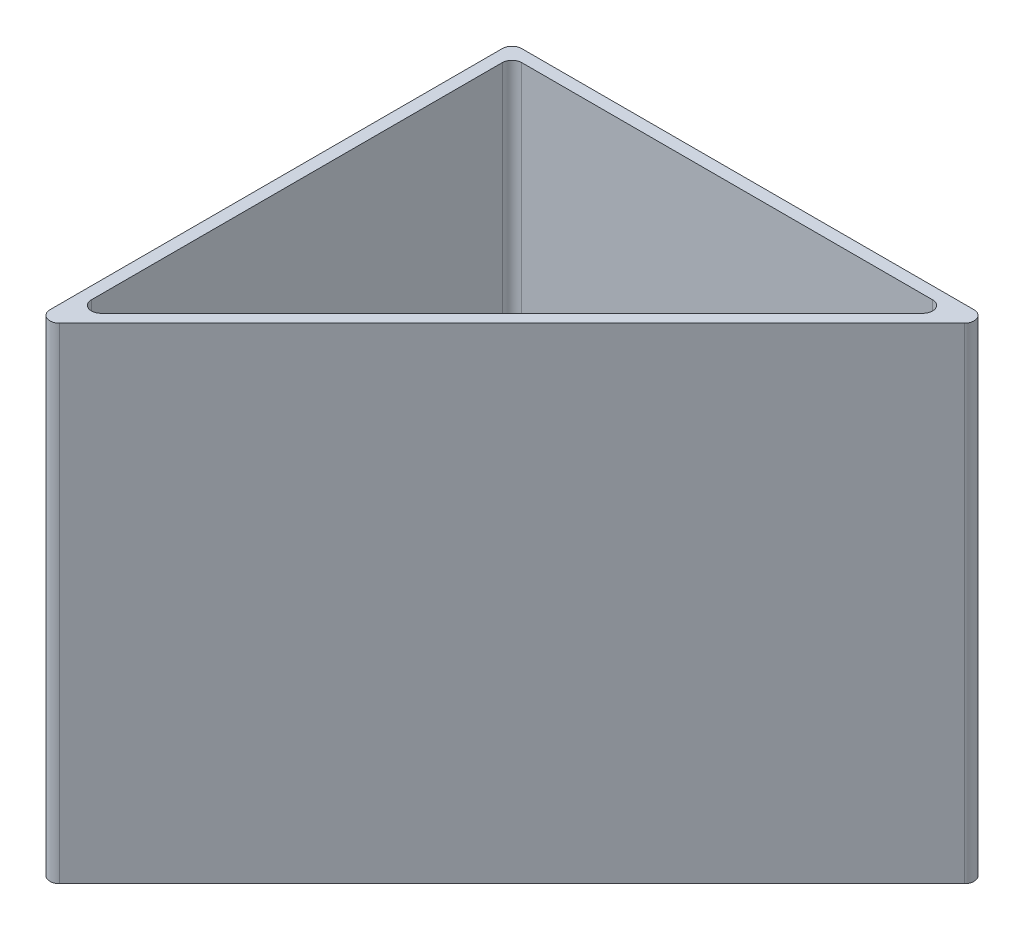
ISO-10303-21;
HEADER;
FILE_DESCRIPTION(('STEP AP214'),'2;1');
FILE_NAME('part.step','',(''),(''),'','','');
FILE_SCHEMA(('AUTOMOTIVE_DESIGN { 1 0 10303 214 1 1 1 1 }'));
ENDSEC;
DATA;
#1=APPLICATION_CONTEXT('core data for automotive mechanical design processes');
#2=APPLICATION_PROTOCOL_DEFINITION('international standard','automotive_design',2000,#1);
#3=PRODUCT_CONTEXT('',#1,'mechanical');
#4=PRODUCT('Part','Part','',(#3));
#5=PRODUCT_RELATED_PRODUCT_CATEGORY('part','',(#4));
#6=PRODUCT_DEFINITION_FORMATION('','',#4);
#7=PRODUCT_DEFINITION_CONTEXT('part definition',#1,'design');
#8=PRODUCT_DEFINITION('design','',#6,#7);
#9=PRODUCT_DEFINITION_SHAPE('','',#8);
#10=(LENGTH_UNIT() NAMED_UNIT(*) SI_UNIT(.MILLI.,.METRE.));
#11=(NAMED_UNIT(*) PLANE_ANGLE_UNIT() SI_UNIT($,.RADIAN.));
#12=(NAMED_UNIT(*) SI_UNIT($,.STERADIAN.) SOLID_ANGLE_UNIT());
#13=UNCERTAINTY_MEASURE_WITH_UNIT(LENGTH_MEASURE(1.E-05),#10,'distance_accuracy_value','');
#14=(GEOMETRIC_REPRESENTATION_CONTEXT(3) GLOBAL_UNCERTAINTY_ASSIGNED_CONTEXT((#13)) GLOBAL_UNIT_ASSIGNED_CONTEXT((#10,
#11,#12)) REPRESENTATION_CONTEXT('',''));
#15=CARTESIAN_POINT('',(0.,0.,0.));
#16=DIRECTION('',(0.,0.,1.));
#17=DIRECTION('',(1.,0.,0.));
#18=AXIS2_PLACEMENT_3D('',#15,#16,#17);
#19=CARTESIAN_POINT('',(100.,100.,1.21240033115588E-13));
#20=DIRECTION('',(0.,0.,1.));
#21=DIRECTION('',(1.,0.,0.));
#22=AXIS2_PLACEMENT_3D('',#19,#20,#21);
#23=PLANE('',#22);
#24=DIRECTION('',(-1.,0.,0.));
#25=VECTOR('',#24,1.);
#26=CARTESIAN_POINT('',(100.,100.,1.21240033115588E-13));
#27=LINE('',#26,#25);
#28=CARTESIAN_POINT('',(95.1715728752538,100.,1.15386046470584E-13));
#29=VERTEX_POINT('',#28);
#30=CARTESIAN_POINT('',(2.,100.,0.));
#31=VERTEX_POINT('',#30);
#32=EDGE_CURVE('E144',#29,#31,#27,.T.);
#33=ORIENTED_EDGE('',*,*,#32,.F.);
#34=DIRECTION('',(0.,-1.,0.));
#35=VECTOR('',#34,1.);
#36=CARTESIAN_POINT('',(95.1715728752538,100.,1.15386046470584E-13));
#37=LINE('',#36,#35);
#38=CARTESIAN_POINT('',(95.1715728752538,0.,1.15386046470584E-13));
#39=VERTEX_POINT('',#38);
#40=EDGE_CURVE('E129',#29,#39,#37,.T.);
#41=ORIENTED_EDGE('',*,*,#40,.T.);
#42=DIRECTION('',(-1.,0.,0.));
#43=VECTOR('',#42,1.);
#44=CARTESIAN_POINT('',(100.,0.,1.21240033115588E-13));
#45=LINE('',#44,#43);
#46=CARTESIAN_POINT('',(2.,0.,0.));
#47=VERTEX_POINT('',#46);
#48=EDGE_CURVE('E141',#39,#47,#45,.T.);
#49=ORIENTED_EDGE('',*,*,#48,.T.);
#50=DIRECTION('',(0.,-1.,0.));
#51=VECTOR('',#50,1.);
#52=CARTESIAN_POINT('',(2.,100.,0.));
#53=LINE('',#52,#51);
#54=EDGE_CURVE('E146',#47,#31,#53,.F.);
#55=ORIENTED_EDGE('',*,*,#54,.T.);
#56=EDGE_LOOP('',(#33,#41,#49,#55));
#57=FACE_BOUND('',#56,.T.);
#58=ADVANCED_FACE('F35',(#57),#23,.F.);
#59=CARTESIAN_POINT('',(0.,100.,0.));
#60=DIRECTION('',(1.,0.,0.));
#61=DIRECTION('',(0.,0.,-1.));
#62=AXIS2_PLACEMENT_3D('',#59,#60,#61);
#63=PLANE('',#62);
#64=DIRECTION('',(0.,0.,1.));
#65=VECTOR('',#64,1.);
#66=CARTESIAN_POINT('',(0.,0.,0.));
#67=LINE('',#66,#65);
#68=CARTESIAN_POINT('',(0.,0.,2.));
#69=VERTEX_POINT('',#68);
#70=CARTESIAN_POINT('',(0.,0.,95.1715728752538));
#71=VERTEX_POINT('',#70);
#72=EDGE_CURVE('E150',#69,#71,#67,.T.);
#73=ORIENTED_EDGE('',*,*,#72,.T.);
#74=DIRECTION('',(0.,-1.,0.));
#75=VECTOR('',#74,1.);
#76=CARTESIAN_POINT('',(0.,100.,95.1715728752538));
#77=LINE('',#76,#75);
#78=CARTESIAN_POINT('',(0.,100.,95.1715728752538));
#79=VERTEX_POINT('',#78);
#80=EDGE_CURVE('E179',#71,#79,#77,.F.);
#81=ORIENTED_EDGE('',*,*,#80,.T.);
#82=DIRECTION('',(0.,0.,1.));
#83=VECTOR('',#82,1.);
#84=CARTESIAN_POINT('',(0.,100.,0.));
#85=LINE('',#84,#83);
#86=CARTESIAN_POINT('',(0.,100.,2.));
#87=VERTEX_POINT('',#86);
#88=EDGE_CURVE('E232',#87,#79,#85,.T.);
#89=ORIENTED_EDGE('',*,*,#88,.F.);
#90=DIRECTION('',(0.,-1.,0.));
#91=VECTOR('',#90,1.);
#92=CARTESIAN_POINT('',(0.,100.,2.));
#93=LINE('',#92,#91);
#94=EDGE_CURVE('E176',#87,#69,#93,.T.);
#95=ORIENTED_EDGE('',*,*,#94,.T.);
#96=EDGE_LOOP('',(#73,#81,#89,#95));
#97=FACE_BOUND('',#96,.T.);
#98=ADVANCED_FACE('F245',(#97),#63,.F.);
#99=CARTESIAN_POINT('',(0.,100.,100.));
#100=DIRECTION('',(-0.707106781186547,0.,-0.707106781186548));
#101=DIRECTION('',(-0.707106781186548,0.,0.707106781186547));
#102=AXIS2_PLACEMENT_3D('',#99,#100,#101);
#103=PLANE('',#102);
#104=DIRECTION('',(0.707106781186548,0.,-0.707106781186547));
#105=VECTOR('',#104,1.);
#106=CARTESIAN_POINT('',(0.,0.,100.));
#107=LINE('',#106,#105);
#108=CARTESIAN_POINT('',(3.41421356237311,0.,96.5857864376269));
#109=VERTEX_POINT('',#108);
#110=CARTESIAN_POINT('',(96.5857864376269,0.,3.41421356237319));
#111=VERTEX_POINT('',#110);
#112=EDGE_CURVE('E154',#109,#111,#107,.T.);
#113=ORIENTED_EDGE('',*,*,#112,.T.);
#114=DIRECTION('',(0.,-1.,0.));
#115=VECTOR('',#114,1.);
#116=CARTESIAN_POINT('',(96.5857864376269,100.,3.4142135623732));
#117=LINE('',#116,#115);
#118=CARTESIAN_POINT('',(96.5857864376269,100.,3.41421356237319));
#119=VERTEX_POINT('',#118);
#120=EDGE_CURVE('E130',#111,#119,#117,.F.);
#121=ORIENTED_EDGE('',*,*,#120,.T.);
#122=DIRECTION('',(0.707106781186548,0.,-0.707106781186547));
#123=VECTOR('',#122,1.);
#124=CARTESIAN_POINT('',(0.,100.,100.));
#125=LINE('',#124,#123);
#126=CARTESIAN_POINT('',(3.41421356237311,100.,96.5857864376269));
#127=VERTEX_POINT('',#126);
#128=EDGE_CURVE('E160',#127,#119,#125,.T.);
#129=ORIENTED_EDGE('',*,*,#128,.F.);
#130=DIRECTION('',(0.,-1.,0.));
#131=VECTOR('',#130,1.);
#132=CARTESIAN_POINT('',(3.41421356237311,100.,96.5857864376269));
#133=LINE('',#132,#131);
#134=EDGE_CURVE('E135',#127,#109,#133,.T.);
#135=ORIENTED_EDGE('',*,*,#134,.T.);
#136=EDGE_LOOP('',(#113,#121,#129,#135));
#137=FACE_BOUND('',#136,.T.);
#138=ADVANCED_FACE('F240',(#137),#103,.F.);
#139=CARTESIAN_POINT('',(0.,100.,0.));
#140=DIRECTION('',(0.,1.,0.));
#141=DIRECTION('',(0.,0.,1.));
#142=AXIS2_PLACEMENT_3D('',#139,#140,#141);
#143=PLANE('',#142);
#144=DIRECTION('',(-1.,0.,0.));
#145=VECTOR('',#144,1.);
#146=CARTESIAN_POINT('',(100.,100.,2.50000000000012));
#147=LINE('',#146,#145);
#148=CARTESIAN_POINT('',(89.136038969321,100.,2.50000000000011));
#149=VERTEX_POINT('',#148);
#150=CARTESIAN_POINT('',(4.5,100.,2.50000000000001));
#151=VERTEX_POINT('',#150);
#152=EDGE_CURVE('E207',#149,#151,#147,.T.);
#153=ORIENTED_EDGE('',*,*,#152,.F.);
#154=CARTESIAN_POINT('',(89.136038969321,100.,4.50000000000012));
#155=DIRECTION('',(0.,1.,0.));
#156=DIRECTION('',(0.,0.,1.));
#157=AXIS2_PLACEMENT_3D('',#154,#155,#156);
#158=CIRCLE('',#157,2.);
#159=CARTESIAN_POINT('',(90.5502525316941,100.,5.91421356237321));
#160=VERTEX_POINT('',#159);
#161=EDGE_CURVE('E199',#149,#160,#158,.F.);
#162=ORIENTED_EDGE('',*,*,#161,.T.);
#163=DIRECTION('',(0.707106781186548,0.,-0.707106781186547));
#164=VECTOR('',#163,1.);
#165=CARTESIAN_POINT('',(-1.76776695296636,100.,98.2322330470336));
#166=LINE('',#165,#164);
#167=CARTESIAN_POINT('',(5.91421356237311,100.,90.5502525316941));
#168=VERTEX_POINT('',#167);
#169=EDGE_CURVE('E151',#168,#160,#166,.T.);
#170=ORIENTED_EDGE('',*,*,#169,.F.);
#171=CARTESIAN_POINT('',(4.50000000000001,100.,89.136038969321));
#172=DIRECTION('',(0.,1.,0.));
#173=DIRECTION('',(0.,0.,1.));
#174=AXIS2_PLACEMENT_3D('',#171,#172,#173);
#175=CIRCLE('',#174,2.);
#176=CARTESIAN_POINT('',(2.50000000000001,100.,89.136038969321));
#177=VERTEX_POINT('',#176);
#178=EDGE_CURVE('E11',#168,#177,#175,.F.);
#179=ORIENTED_EDGE('',*,*,#178,.T.);
#180=DIRECTION('',(0.,0.,1.));
#181=VECTOR('',#180,1.);
#182=CARTESIAN_POINT('',(2.5,100.,0.));
#183=LINE('',#182,#181);
#184=CARTESIAN_POINT('',(2.5,100.,4.50000000000001));
#185=VERTEX_POINT('',#184);
#186=EDGE_CURVE('E157',#185,#177,#183,.T.);
#187=ORIENTED_EDGE('',*,*,#186,.F.);
#188=CARTESIAN_POINT('',(4.5,100.,4.50000000000001));
#189=DIRECTION('',(0.,1.,0.));
#190=DIRECTION('',(0.,0.,1.));
#191=AXIS2_PLACEMENT_3D('',#188,#189,#190);
#192=CIRCLE('',#191,2.);
#193=EDGE_CURVE('E43',#185,#151,#192,.F.);
#194=ORIENTED_EDGE('',*,*,#193,.T.);
#195=EDGE_LOOP('',(#153,#162,#170,#179,#187,#194));
#196=FACE_BOUND('',#195,.T.);
#197=ORIENTED_EDGE('',*,*,#128,.T.);
#198=CARTESIAN_POINT('',(95.1715728752538,100.,2.00000000000012));
#199=DIRECTION('',(0.,1.,0.));
#200=DIRECTION('',(0.,0.,1.));
#201=AXIS2_PLACEMENT_3D('',#198,#199,#200);
#202=CIRCLE('',#201,2.);
#203=EDGE_CURVE('E174',#119,#29,#202,.T.);
#204=ORIENTED_EDGE('',*,*,#203,.T.);
#205=ORIENTED_EDGE('',*,*,#32,.T.);
#206=CARTESIAN_POINT('',(2.,100.,2.));
#207=DIRECTION('',(0.,1.,0.));
#208=DIRECTION('',(0.,0.,1.));
#209=AXIS2_PLACEMENT_3D('',#206,#207,#208);
#210=CIRCLE('',#209,2.);
#211=EDGE_CURVE('E170',#31,#87,#210,.T.);
#212=ORIENTED_EDGE('',*,*,#211,.T.);
#213=ORIENTED_EDGE('',*,*,#88,.T.);
#214=CARTESIAN_POINT('',(2.00000000000001,100.,95.1715728752538));
#215=DIRECTION('',(0.,1.,0.));
#216=DIRECTION('',(0.,0.,1.));
#217=AXIS2_PLACEMENT_3D('',#214,#215,#216);
#218=CIRCLE('',#217,2.);
#219=EDGE_CURVE('E172',#79,#127,#218,.T.);
#220=ORIENTED_EDGE('',*,*,#219,.T.);
#221=EDGE_LOOP('',(#197,#204,#205,#212,#213,#220));
#222=FACE_BOUND('',#221,.T.);
#223=ADVANCED_FACE('F205',(#196,#222),#143,.T.);
#224=CARTESIAN_POINT('',(0.,0.,0.));
#225=DIRECTION('',(0.,1.,0.));
#226=DIRECTION('',(0.,0.,1.));
#227=AXIS2_PLACEMENT_3D('',#224,#225,#226);
#228=PLANE('',#227);
#229=CARTESIAN_POINT('',(14.1421356237309,0.,14.142135623731));
#230=DIRECTION('',(0.,1.,0.));
#231=DIRECTION('',(0.,0.,1.));
#232=AXIS2_PLACEMENT_3D('',#229,#230,#231);
#233=CIRCLE('',#232,2.1);
#234=CARTESIAN_POINT('',(14.1421356237309,0.,16.242135623731));
#235=VERTEX_POINT('',#234);
#236=EDGE_CURVE('E413',#235,#235,#233,.T.);
#237=ORIENTED_EDGE('',*,*,#236,.T.);
#238=EDGE_LOOP('',(#237));
#239=FACE_BOUND('',#238,.T.);
#240=CARTESIAN_POINT('',(14.1421356237309,0.,57.5735931288071));
#241=DIRECTION('',(0.,1.,0.));
#242=DIRECTION('',(0.,0.,1.));
#243=AXIS2_PLACEMENT_3D('',#240,#241,#242);
#244=CIRCLE('',#243,2.1);
#245=CARTESIAN_POINT('',(14.1421356237309,0.,59.6735931288071));
#246=VERTEX_POINT('',#245);
#247=EDGE_CURVE('E417',#246,#246,#244,.T.);
#248=ORIENTED_EDGE('',*,*,#247,.T.);
#249=EDGE_LOOP('',(#248));
#250=FACE_BOUND('',#249,.T.);
#251=CARTESIAN_POINT('',(57.5735931288071,0.,14.142135623731));
#252=DIRECTION('',(0.,1.,0.));
#253=DIRECTION('',(0.,0.,1.));
#254=AXIS2_PLACEMENT_3D('',#251,#252,#253);
#255=CIRCLE('',#254,2.1);
#256=CARTESIAN_POINT('',(57.5735931288071,0.,16.242135623731));
#257=VERTEX_POINT('',#256);
#258=EDGE_CURVE('E227',#257,#257,#255,.T.);
#259=ORIENTED_EDGE('',*,*,#258,.T.);
#260=EDGE_LOOP('',(#259));
#261=FACE_BOUND('',#260,.T.);
#262=ORIENTED_EDGE('',*,*,#48,.F.);
#263=CARTESIAN_POINT('',(95.1715728752538,0.,2.00000000000012));
#264=DIRECTION('',(0.,1.,0.));
#265=DIRECTION('',(0.,0.,1.));
#266=AXIS2_PLACEMENT_3D('',#263,#264,#265);
#267=CIRCLE('',#266,2.);
#268=EDGE_CURVE('E125',#39,#111,#267,.F.);
#269=ORIENTED_EDGE('',*,*,#268,.T.);
#270=ORIENTED_EDGE('',*,*,#112,.F.);
#271=CARTESIAN_POINT('',(2.00000000000001,0.,95.1715728752538));
#272=DIRECTION('',(0.,1.,0.));
#273=DIRECTION('',(0.,0.,1.));
#274=AXIS2_PLACEMENT_3D('',#271,#272,#273);
#275=CIRCLE('',#274,2.);
#276=EDGE_CURVE('E136',#109,#71,#275,.F.);
#277=ORIENTED_EDGE('',*,*,#276,.T.);
#278=ORIENTED_EDGE('',*,*,#72,.F.);
#279=CARTESIAN_POINT('',(2.,0.,2.));
#280=DIRECTION('',(0.,1.,0.));
#281=DIRECTION('',(0.,0.,1.));
#282=AXIS2_PLACEMENT_3D('',#279,#280,#281);
#283=CIRCLE('',#282,2.);
#284=EDGE_CURVE('E145',#69,#47,#283,.F.);
#285=ORIENTED_EDGE('',*,*,#284,.T.);
#286=EDGE_LOOP('',(#262,#269,#270,#277,#278,#285));
#287=FACE_BOUND('',#286,.T.);
#288=ADVANCED_FACE('F148',(#239,#250,#261,#287),#228,.F.);
#289=CARTESIAN_POINT('',(100.,100.,2.50000000000012));
#290=DIRECTION('',(0.,0.,1.));
#291=DIRECTION('',(1.,0.,0.));
#292=AXIS2_PLACEMENT_3D('',#289,#290,#291);
#293=PLANE('',#292);
#294=DIRECTION('',(-1.,0.,0.));
#295=VECTOR('',#294,1.);
#296=CARTESIAN_POINT('',(100.,2.5,2.50000000000012));
#297=LINE('',#296,#295);
#298=CARTESIAN_POINT('',(89.136038969321,2.5,2.50000000000011));
#299=VERTEX_POINT('',#298);
#300=CARTESIAN_POINT('',(4.5,2.5,2.50000000000001));
#301=VERTEX_POINT('',#300);
#302=EDGE_CURVE('E223',#299,#301,#297,.T.);
#303=ORIENTED_EDGE('',*,*,#302,.F.);
#304=DIRECTION('',(0.,-1.,0.));
#305=VECTOR('',#304,1.);
#306=CARTESIAN_POINT('',(89.136038969321,100.,2.50000000000011));
#307=LINE('',#306,#305);
#308=EDGE_CURVE('E193',#299,#149,#307,.F.);
#309=ORIENTED_EDGE('',*,*,#308,.T.);
#310=ORIENTED_EDGE('',*,*,#152,.T.);
#311=DIRECTION('',(0.,-1.,0.));
#312=VECTOR('',#311,1.);
#313=CARTESIAN_POINT('',(4.50000000000001,2.5,2.50000000000001));
#314=LINE('',#313,#312);
#315=EDGE_CURVE('E190',#151,#301,#314,.T.);
#316=ORIENTED_EDGE('',*,*,#315,.T.);
#317=EDGE_LOOP('',(#303,#309,#310,#316));
#318=FACE_BOUND('',#317,.T.);
#319=ADVANCED_FACE('F215',(#318),#293,.T.);
#320=CARTESIAN_POINT('',(2.5,100.,0.));
#321=DIRECTION('',(1.,0.,0.));
#322=DIRECTION('',(0.,0.,-1.));
#323=AXIS2_PLACEMENT_3D('',#320,#321,#322);
#324=PLANE('',#323);
#325=DIRECTION('',(0.,0.,1.));
#326=VECTOR('',#325,1.);
#327=CARTESIAN_POINT('',(2.5,2.5,0.));
#328=LINE('',#327,#326);
#329=CARTESIAN_POINT('',(2.5,2.5,4.50000000000001));
#330=VERTEX_POINT('',#329);
#331=CARTESIAN_POINT('',(2.50000000000001,2.5,89.136038969321));
#332=VERTEX_POINT('',#331);
#333=EDGE_CURVE('E222',#330,#332,#328,.T.);
#334=ORIENTED_EDGE('',*,*,#333,.F.);
#335=DIRECTION('',(0.,-1.,0.));
#336=VECTOR('',#335,1.);
#337=CARTESIAN_POINT('',(2.5,100.,4.50000000000001));
#338=LINE('',#337,#336);
#339=EDGE_CURVE('E197',#330,#185,#338,.F.);
#340=ORIENTED_EDGE('',*,*,#339,.T.);
#341=ORIENTED_EDGE('',*,*,#186,.T.);
#342=DIRECTION('',(0.,-1.,0.));
#343=VECTOR('',#342,1.);
#344=CARTESIAN_POINT('',(2.50000000000001,2.5,89.136038969321));
#345=LINE('',#344,#343);
#346=EDGE_CURVE('E195',#177,#332,#345,.T.);
#347=ORIENTED_EDGE('',*,*,#346,.T.);
#348=EDGE_LOOP('',(#334,#340,#341,#347));
#349=FACE_BOUND('',#348,.T.);
#350=ADVANCED_FACE('F221',(#349),#324,.T.);
#351=CARTESIAN_POINT('',(-1.76776695296636,100.,98.2322330470336));
#352=DIRECTION('',(-0.707106781186547,0.,-0.707106781186548));
#353=DIRECTION('',(-0.707106781186548,0.,0.707106781186547));
#354=AXIS2_PLACEMENT_3D('',#351,#352,#353);
#355=PLANE('',#354);
#356=ORIENTED_EDGE('',*,*,#169,.T.);
#357=DIRECTION('',(0.,-1.,0.));
#358=VECTOR('',#357,1.);
#359=CARTESIAN_POINT('',(90.5502525316941,2.5,5.91421356237322));
#360=LINE('',#359,#358);
#361=CARTESIAN_POINT('',(90.5502525316941,2.5,5.91421356237321));
#362=VERTEX_POINT('',#361);
#363=EDGE_CURVE('E183',#160,#362,#360,.T.);
#364=ORIENTED_EDGE('',*,*,#363,.T.);
#365=DIRECTION('',(0.707106781186548,0.,-0.707106781186547));
#366=VECTOR('',#365,1.);
#367=CARTESIAN_POINT('',(-1.76776695296636,2.5,98.2322330470336));
#368=LINE('',#367,#366);
#369=CARTESIAN_POINT('',(5.91421356237311,2.5,90.5502525316941));
#370=VERTEX_POINT('',#369);
#371=EDGE_CURVE('E217',#370,#362,#368,.T.);
#372=ORIENTED_EDGE('',*,*,#371,.F.);
#373=DIRECTION('',(0.,-1.,0.));
#374=VECTOR('',#373,1.);
#375=CARTESIAN_POINT('',(5.9142135623731,100.,90.5502525316941));
#376=LINE('',#375,#374);
#377=EDGE_CURVE('E181',#370,#168,#376,.F.);
#378=ORIENTED_EDGE('',*,*,#377,.T.);
#379=EDGE_LOOP('',(#356,#364,#372,#378));
#380=FACE_BOUND('',#379,.T.);
#381=ADVANCED_FACE('F293',(#380),#355,.T.);
#382=CARTESIAN_POINT('',(0.,2.5,0.));
#383=DIRECTION('',(0.,1.,0.));
#384=DIRECTION('',(0.,0.,1.));
#385=AXIS2_PLACEMENT_3D('',#382,#383,#384);
#386=PLANE('',#385);
#387=CARTESIAN_POINT('',(14.1421356237309,2.5,14.142135623731));
#388=DIRECTION('',(0.,1.,0.));
#389=DIRECTION('',(0.,0.,1.));
#390=AXIS2_PLACEMENT_3D('',#387,#388,#389);
#391=CIRCLE('',#390,2.1);
#392=CARTESIAN_POINT('',(14.1421356237309,2.5,16.242135623731));
#393=VERTEX_POINT('',#392);
#394=EDGE_CURVE('E429',#393,#393,#391,.T.);
#395=ORIENTED_EDGE('',*,*,#394,.F.);
#396=EDGE_LOOP('',(#395));
#397=FACE_BOUND('',#396,.T.);
#398=CARTESIAN_POINT('',(14.1421356237309,2.5,57.5735931288071));
#399=DIRECTION('',(0.,1.,0.));
#400=DIRECTION('',(0.,0.,1.));
#401=AXIS2_PLACEMENT_3D('',#398,#399,#400);
#402=CIRCLE('',#401,2.1);
#403=CARTESIAN_POINT('',(14.1421356237309,2.5,59.6735931288071));
#404=VERTEX_POINT('',#403);
#405=EDGE_CURVE('E425',#404,#404,#402,.T.);
#406=ORIENTED_EDGE('',*,*,#405,.F.);
#407=EDGE_LOOP('',(#406));
#408=FACE_BOUND('',#407,.T.);
#409=CARTESIAN_POINT('',(57.5735931288071,2.5,14.142135623731));
#410=DIRECTION('',(0.,1.,0.));
#411=DIRECTION('',(0.,0.,1.));
#412=AXIS2_PLACEMENT_3D('',#409,#410,#411);
#413=CIRCLE('',#412,2.1);
#414=CARTESIAN_POINT('',(57.5735931288071,2.5,16.242135623731));
#415=VERTEX_POINT('',#414);
#416=EDGE_CURVE('E420',#415,#415,#413,.T.);
#417=ORIENTED_EDGE('',*,*,#416,.F.);
#418=EDGE_LOOP('',(#417));
#419=FACE_BOUND('',#418,.T.);
#420=ORIENTED_EDGE('',*,*,#371,.T.);
#421=CARTESIAN_POINT('',(89.136038969321,2.5,4.50000000000012));
#422=DIRECTION('',(0.,1.,0.));
#423=DIRECTION('',(0.,0.,1.));
#424=AXIS2_PLACEMENT_3D('',#421,#422,#423);
#425=CIRCLE('',#424,2.);
#426=EDGE_CURVE('E188',#362,#299,#425,.T.);
#427=ORIENTED_EDGE('',*,*,#426,.T.);
#428=ORIENTED_EDGE('',*,*,#302,.T.);
#429=CARTESIAN_POINT('',(4.5,2.5,4.50000000000001));
#430=DIRECTION('',(0.,1.,0.));
#431=DIRECTION('',(0.,0.,1.));
#432=AXIS2_PLACEMENT_3D('',#429,#430,#431);
#433=CIRCLE('',#432,2.);
#434=EDGE_CURVE('E58',#301,#330,#433,.T.);
#435=ORIENTED_EDGE('',*,*,#434,.T.);
#436=ORIENTED_EDGE('',*,*,#333,.T.);
#437=CARTESIAN_POINT('',(4.50000000000001,2.5,89.136038969321));
#438=DIRECTION('',(0.,1.,0.));
#439=DIRECTION('',(0.,0.,1.));
#440=AXIS2_PLACEMENT_3D('',#437,#438,#439);
#441=CIRCLE('',#440,2.);
#442=EDGE_CURVE('E50',#332,#370,#441,.T.);
#443=ORIENTED_EDGE('',*,*,#442,.T.);
#444=EDGE_LOOP('',(#420,#427,#428,#435,#436,#443));
#445=FACE_BOUND('',#444,.T.);
#446=ADVANCED_FACE('F287',(#397,#408,#419,#445),#386,.T.);
#447=CARTESIAN_POINT('',(57.5735931288071,2.5,14.142135623731));
#448=DIRECTION('',(0.,1.,0.));
#449=DIRECTION('',(0.,0.,1.));
#450=AXIS2_PLACEMENT_3D('',#447,#448,#449);
#451=CYLINDRICAL_SURFACE('',#450,2.1);
#452=ORIENTED_EDGE('',*,*,#258,.F.);
#453=EDGE_LOOP('',(#452));
#454=FACE_BOUND('',#453,.T.);
#455=ORIENTED_EDGE('',*,*,#416,.T.);
#456=EDGE_LOOP('',(#455));
#457=FACE_BOUND('',#456,.T.);
#458=ADVANCED_FACE('F279',(#454,#457),#451,.F.);
#459=CARTESIAN_POINT('',(14.1421356237309,2.5,57.5735931288071));
#460=DIRECTION('',(0.,1.,0.));
#461=DIRECTION('',(0.,0.,1.));
#462=AXIS2_PLACEMENT_3D('',#459,#460,#461);
#463=CYLINDRICAL_SURFACE('',#462,2.1);
#464=ORIENTED_EDGE('',*,*,#247,.F.);
#465=EDGE_LOOP('',(#464));
#466=FACE_BOUND('',#465,.T.);
#467=ORIENTED_EDGE('',*,*,#405,.T.);
#468=EDGE_LOOP('',(#467));
#469=FACE_BOUND('',#468,.T.);
#470=ADVANCED_FACE('F273',(#466,#469),#463,.F.);
#471=CARTESIAN_POINT('',(14.1421356237309,2.5,14.142135623731));
#472=DIRECTION('',(0.,1.,0.));
#473=DIRECTION('',(0.,0.,1.));
#474=AXIS2_PLACEMENT_3D('',#471,#472,#473);
#475=CYLINDRICAL_SURFACE('',#474,2.1);
#476=ORIENTED_EDGE('',*,*,#236,.F.);
#477=EDGE_LOOP('',(#476));
#478=FACE_BOUND('',#477,.T.);
#479=ORIENTED_EDGE('',*,*,#394,.T.);
#480=EDGE_LOOP('',(#479));
#481=FACE_BOUND('',#480,.T.);
#482=ADVANCED_FACE('F269',(#478,#481),#475,.F.);
#483=CARTESIAN_POINT('',(95.1715728752538,100.,2.00000000000012));
#484=DIRECTION('',(0.,-1.,0.));
#485=DIRECTION('',(0.,0.,-1.));
#486=AXIS2_PLACEMENT_3D('',#483,#484,#485);
#487=CYLINDRICAL_SURFACE('',#486,2.);
#488=ORIENTED_EDGE('',*,*,#203,.F.);
#489=ORIENTED_EDGE('',*,*,#120,.F.);
#490=ORIENTED_EDGE('',*,*,#268,.F.);
#491=ORIENTED_EDGE('',*,*,#40,.F.);
#492=EDGE_LOOP('',(#488,#489,#490,#491));
#493=FACE_BOUND('',#492,.T.);
#494=ADVANCED_FACE('F128',(#493),#487,.T.);
#495=CARTESIAN_POINT('',(2.00000000000001,100.,95.1715728752538));
#496=DIRECTION('',(0.,-1.,0.));
#497=DIRECTION('',(0.,0.,-1.));
#498=AXIS2_PLACEMENT_3D('',#495,#496,#497);
#499=CYLINDRICAL_SURFACE('',#498,2.);
#500=ORIENTED_EDGE('',*,*,#219,.F.);
#501=ORIENTED_EDGE('',*,*,#80,.F.);
#502=ORIENTED_EDGE('',*,*,#276,.F.);
#503=ORIENTED_EDGE('',*,*,#134,.F.);
#504=EDGE_LOOP('',(#500,#501,#502,#503));
#505=FACE_BOUND('',#504,.T.);
#506=ADVANCED_FACE('F242',(#505),#499,.T.);
#507=CARTESIAN_POINT('',(2.,100.,2.));
#508=DIRECTION('',(0.,-1.,0.));
#509=DIRECTION('',(0.,0.,-1.));
#510=AXIS2_PLACEMENT_3D('',#507,#508,#509);
#511=CYLINDRICAL_SURFACE('',#510,2.);
#512=ORIENTED_EDGE('',*,*,#211,.F.);
#513=ORIENTED_EDGE('',*,*,#54,.F.);
#514=ORIENTED_EDGE('',*,*,#284,.F.);
#515=ORIENTED_EDGE('',*,*,#94,.F.);
#516=EDGE_LOOP('',(#512,#513,#514,#515));
#517=FACE_BOUND('',#516,.T.);
#518=ADVANCED_FACE('F249',(#517),#511,.T.);
#519=CARTESIAN_POINT('',(89.136038969321,100.,4.50000000000012));
#520=DIRECTION('',(0.,1.,0.));
#521=DIRECTION('',(0.,0.,1.));
#522=AXIS2_PLACEMENT_3D('',#519,#520,#521);
#523=CYLINDRICAL_SURFACE('',#522,2.);
#524=ORIENTED_EDGE('',*,*,#161,.F.);
#525=ORIENTED_EDGE('',*,*,#308,.F.);
#526=ORIENTED_EDGE('',*,*,#426,.F.);
#527=ORIENTED_EDGE('',*,*,#363,.F.);
#528=EDGE_LOOP('',(#524,#525,#526,#527));
#529=FACE_BOUND('',#528,.T.);
#530=ADVANCED_FACE('F251',(#529),#523,.F.);
#531=CARTESIAN_POINT('',(4.5,100.,4.50000000000001));
#532=DIRECTION('',(0.,1.,0.));
#533=DIRECTION('',(0.,0.,1.));
#534=AXIS2_PLACEMENT_3D('',#531,#532,#533);
#535=CYLINDRICAL_SURFACE('',#534,2.);
#536=ORIENTED_EDGE('',*,*,#193,.F.);
#537=ORIENTED_EDGE('',*,*,#339,.F.);
#538=ORIENTED_EDGE('',*,*,#434,.F.);
#539=ORIENTED_EDGE('',*,*,#315,.F.);
#540=EDGE_LOOP('',(#536,#537,#538,#539));
#541=FACE_BOUND('',#540,.T.);
#542=ADVANCED_FACE('F219',(#541),#535,.F.);
#543=CARTESIAN_POINT('',(4.50000000000001,100.,89.136038969321));
#544=DIRECTION('',(0.,1.,0.));
#545=DIRECTION('',(0.,0.,1.));
#546=AXIS2_PLACEMENT_3D('',#543,#544,#545);
#547=CYLINDRICAL_SURFACE('',#546,2.);
#548=ORIENTED_EDGE('',*,*,#178,.F.);
#549=ORIENTED_EDGE('',*,*,#377,.F.);
#550=ORIENTED_EDGE('',*,*,#442,.F.);
#551=ORIENTED_EDGE('',*,*,#346,.F.);
#552=EDGE_LOOP('',(#548,#549,#550,#551));
#553=FACE_BOUND('',#552,.T.);
#554=ADVANCED_FACE('F37',(#553),#547,.F.);
#555=CLOSED_SHELL('',(#58,#98,#138,#223,#288,#319,#350,#381,#446,#458,#470,#482,#494,#506,#518,
#530,#542,#554));
#556=MANIFOLD_SOLID_BREP('B2',#555);
#557=ADVANCED_BREP_SHAPE_REPRESENTATION('',(#18,#556),#14);
#558=SHAPE_DEFINITION_REPRESENTATION(#9,#557);
ENDSEC;
END-ISO-10303-21;
